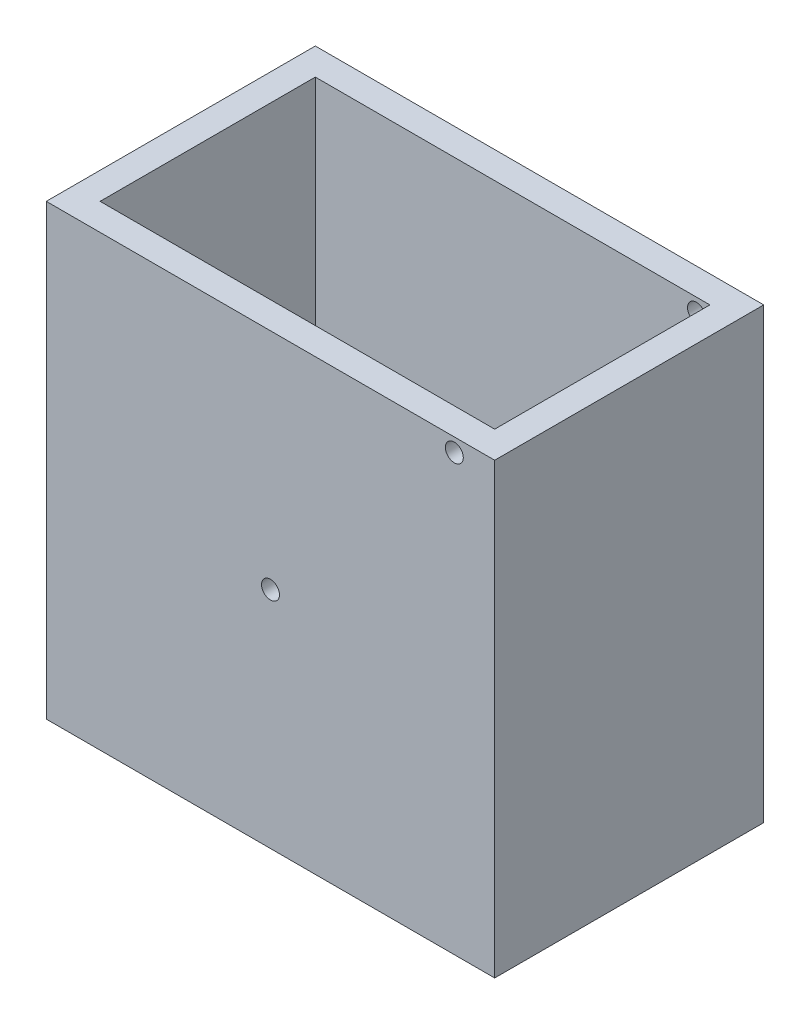
ISO-10303-21;
HEADER;
FILE_DESCRIPTION(('STEP AP214'),'2;1');
FILE_NAME('part.step','',(''),(''),'','','');
FILE_SCHEMA(('AUTOMOTIVE_DESIGN { 1 0 10303 214 1 1 1 1 }'));
ENDSEC;
DATA;
#1=APPLICATION_CONTEXT('core data for automotive mechanical design processes');
#2=APPLICATION_PROTOCOL_DEFINITION('international standard','automotive_design',2000,#1);
#3=PRODUCT_CONTEXT('',#1,'mechanical');
#4=PRODUCT('Part','Part','',(#3));
#5=PRODUCT_RELATED_PRODUCT_CATEGORY('part','',(#4));
#6=PRODUCT_DEFINITION_FORMATION('','',#4);
#7=PRODUCT_DEFINITION_CONTEXT('part definition',#1,'design');
#8=PRODUCT_DEFINITION('design','',#6,#7);
#9=PRODUCT_DEFINITION_SHAPE('','',#8);
#10=(LENGTH_UNIT() NAMED_UNIT(*) SI_UNIT(.MILLI.,.METRE.));
#11=(NAMED_UNIT(*) PLANE_ANGLE_UNIT() SI_UNIT($,.RADIAN.));
#12=(NAMED_UNIT(*) SI_UNIT($,.STERADIAN.) SOLID_ANGLE_UNIT());
#13=UNCERTAINTY_MEASURE_WITH_UNIT(LENGTH_MEASURE(1.E-05),#10,'distance_accuracy_value','');
#14=(GEOMETRIC_REPRESENTATION_CONTEXT(3) GLOBAL_UNCERTAINTY_ASSIGNED_CONTEXT((#13)) GLOBAL_UNIT_ASSIGNED_CONTEXT((#10,
#11,#12)) REPRESENTATION_CONTEXT('',''));
#15=CARTESIAN_POINT('',(0.,0.,0.));
#16=DIRECTION('',(0.,0.,1.));
#17=DIRECTION('',(1.,0.,0.));
#18=AXIS2_PLACEMENT_3D('',#15,#16,#17);
#19=CARTESIAN_POINT('',(0.,0.,150.));
#20=DIRECTION('',(1.,0.,0.));
#21=DIRECTION('',(0.,0.,-1.));
#22=AXIS2_PLACEMENT_3D('',#19,#20,#21);
#23=PLANE('',#22);
#24=DIRECTION('',(0.,-1.,0.));
#25=VECTOR('',#24,1.);
#26=CARTESIAN_POINT('',(0.,0.,0.));
#27=LINE('',#26,#25);
#28=CARTESIAN_POINT('',(0.,0.,0.));
#29=VERTEX_POINT('',#28);
#30=CARTESIAN_POINT('',(0.,-250.,0.));
#31=VERTEX_POINT('',#30);
#32=EDGE_CURVE('E148',#29,#31,#27,.T.);
#33=ORIENTED_EDGE('',*,*,#32,.T.);
#34=DIRECTION('',(0.,0.,-1.));
#35=VECTOR('',#34,1.);
#36=CARTESIAN_POINT('',(0.,-250.,150.));
#37=LINE('',#36,#35);
#38=CARTESIAN_POINT('',(0.,-250.,150.));
#39=VERTEX_POINT('',#38);
#40=EDGE_CURVE('E11',#39,#31,#37,.T.);
#41=ORIENTED_EDGE('',*,*,#40,.F.);
#42=DIRECTION('',(0.,-1.,0.));
#43=VECTOR('',#42,1.);
#44=CARTESIAN_POINT('',(0.,0.,150.));
#45=LINE('',#44,#43);
#46=CARTESIAN_POINT('',(0.,0.,150.));
#47=VERTEX_POINT('',#46);
#48=EDGE_CURVE('E152',#47,#39,#45,.T.);
#49=ORIENTED_EDGE('',*,*,#48,.F.);
#50=DIRECTION('',(0.,0.,-1.));
#51=VECTOR('',#50,1.);
#52=CARTESIAN_POINT('',(0.,0.,150.));
#53=LINE('',#52,#51);
#54=EDGE_CURVE('E158',#47,#29,#53,.T.);
#55=ORIENTED_EDGE('',*,*,#54,.T.);
#56=EDGE_LOOP('',(#33,#41,#49,#55));
#57=FACE_BOUND('',#56,.T.);
#58=ADVANCED_FACE('F35',(#57),#23,.F.);
#59=CARTESIAN_POINT('',(0.,-250.,150.));
#60=DIRECTION('',(0.,1.,0.));
#61=DIRECTION('',(0.,0.,1.));
#62=AXIS2_PLACEMENT_3D('',#59,#60,#61);
#63=PLANE('',#62);
#64=DIRECTION('',(1.,0.,0.));
#65=VECTOR('',#64,1.);
#66=CARTESIAN_POINT('',(0.,-250.,0.));
#67=LINE('',#66,#65);
#68=CARTESIAN_POINT('',(250.,-250.,0.));
#69=VERTEX_POINT('',#68);
#70=EDGE_CURVE('E161',#31,#69,#67,.T.);
#71=ORIENTED_EDGE('',*,*,#70,.T.);
#72=DIRECTION('',(0.,0.,-1.));
#73=VECTOR('',#72,1.);
#74=CARTESIAN_POINT('',(250.,-250.,150.));
#75=LINE('',#74,#73);
#76=CARTESIAN_POINT('',(250.,-250.,150.));
#77=VERTEX_POINT('',#76);
#78=EDGE_CURVE('E43',#77,#69,#75,.T.);
#79=ORIENTED_EDGE('',*,*,#78,.F.);
#80=DIRECTION('',(1.,0.,0.));
#81=VECTOR('',#80,1.);
#82=CARTESIAN_POINT('',(0.,-250.,150.));
#83=LINE('',#82,#81);
#84=EDGE_CURVE('E88',#39,#77,#83,.T.);
#85=ORIENTED_EDGE('',*,*,#84,.F.);
#86=ORIENTED_EDGE('',*,*,#40,.T.);
#87=EDGE_LOOP('',(#71,#79,#85,#86));
#88=FACE_BOUND('',#87,.T.);
#89=ADVANCED_FACE('F213',(#88),#63,.F.);
#90=CARTESIAN_POINT('',(250.,0.,150.));
#91=DIRECTION('',(-1.,0.,0.));
#92=DIRECTION('',(0.,-1.,0.));
#93=AXIS2_PLACEMENT_3D('',#90,#91,#92);
#94=PLANE('',#93);
#95=DIRECTION('',(0.,1.,0.));
#96=VECTOR('',#95,1.);
#97=CARTESIAN_POINT('',(250.,0.,0.));
#98=LINE('',#97,#96);
#99=CARTESIAN_POINT('',(250.,0.,0.));
#100=VERTEX_POINT('',#99);
#101=EDGE_CURVE('E163',#69,#100,#98,.T.);
#102=ORIENTED_EDGE('',*,*,#101,.T.);
#103=DIRECTION('',(0.,0.,-1.));
#104=VECTOR('',#103,1.);
#105=CARTESIAN_POINT('',(250.,0.,150.));
#106=LINE('',#105,#104);
#107=CARTESIAN_POINT('',(250.,0.,150.));
#108=VERTEX_POINT('',#107);
#109=EDGE_CURVE('E167',#108,#100,#106,.T.);
#110=ORIENTED_EDGE('',*,*,#109,.F.);
#111=DIRECTION('',(0.,1.,0.));
#112=VECTOR('',#111,1.);
#113=CARTESIAN_POINT('',(250.,0.,150.));
#114=LINE('',#113,#112);
#115=EDGE_CURVE('E155',#77,#108,#114,.T.);
#116=ORIENTED_EDGE('',*,*,#115,.F.);
#117=ORIENTED_EDGE('',*,*,#78,.T.);
#118=EDGE_LOOP('',(#102,#110,#116,#117));
#119=FACE_BOUND('',#118,.T.);
#120=ADVANCED_FACE('F218',(#119),#94,.F.);
#121=CARTESIAN_POINT('',(0.,0.,150.));
#122=DIRECTION('',(0.,-1.,0.));
#123=DIRECTION('',(0.,0.,-1.));
#124=AXIS2_PLACEMENT_3D('',#121,#122,#123);
#125=PLANE('',#124);
#126=DIRECTION('',(1.,0.,0.));
#127=VECTOR('',#126,1.);
#128=CARTESIAN_POINT('',(235.,0.,135.));
#129=LINE('',#128,#127);
#130=CARTESIAN_POINT('',(15.,0.,135.));
#131=VERTEX_POINT('',#130);
#132=CARTESIAN_POINT('',(235.,0.,135.));
#133=VERTEX_POINT('',#132);
#134=EDGE_CURVE('E142',#131,#133,#129,.T.);
#135=ORIENTED_EDGE('',*,*,#134,.F.);
#136=DIRECTION('',(0.,0.,1.));
#137=VECTOR('',#136,1.);
#138=CARTESIAN_POINT('',(15.,0.,135.));
#139=LINE('',#138,#137);
#140=CARTESIAN_POINT('',(15.,0.,15.));
#141=VERTEX_POINT('',#140);
#142=EDGE_CURVE('E51',#141,#131,#139,.T.);
#143=ORIENTED_EDGE('',*,*,#142,.F.);
#144=DIRECTION('',(-1.,0.,0.));
#145=VECTOR('',#144,1.);
#146=CARTESIAN_POINT('',(235.,0.,15.));
#147=LINE('',#146,#145);
#148=CARTESIAN_POINT('',(235.,0.,15.));
#149=VERTEX_POINT('',#148);
#150=EDGE_CURVE('E130',#149,#141,#147,.T.);
#151=ORIENTED_EDGE('',*,*,#150,.F.);
#152=DIRECTION('',(0.,0.,-1.));
#153=VECTOR('',#152,1.);
#154=CARTESIAN_POINT('',(235.,0.,135.));
#155=LINE('',#154,#153);
#156=EDGE_CURVE('E133',#133,#149,#155,.T.);
#157=ORIENTED_EDGE('',*,*,#156,.F.);
#158=EDGE_LOOP('',(#135,#143,#151,#157));
#159=FACE_BOUND('',#158,.T.);
#160=DIRECTION('',(-1.,0.,0.));
#161=VECTOR('',#160,1.);
#162=CARTESIAN_POINT('',(0.,0.,0.));
#163=LINE('',#162,#161);
#164=EDGE_CURVE('E81',#100,#29,#163,.T.);
#165=ORIENTED_EDGE('',*,*,#164,.T.);
#166=ORIENTED_EDGE('',*,*,#54,.F.);
#167=DIRECTION('',(-1.,0.,0.));
#168=VECTOR('',#167,1.);
#169=CARTESIAN_POINT('',(0.,0.,150.));
#170=LINE('',#169,#168);
#171=EDGE_CURVE('E60',#108,#47,#170,.T.);
#172=ORIENTED_EDGE('',*,*,#171,.F.);
#173=ORIENTED_EDGE('',*,*,#109,.T.);
#174=EDGE_LOOP('',(#165,#166,#172,#173));
#175=FACE_BOUND('',#174,.T.);
#176=ADVANCED_FACE('F230',(#159,#175),#125,.F.);
#177=CARTESIAN_POINT('',(0.,0.,150.));
#178=DIRECTION('',(0.,0.,1.));
#179=DIRECTION('',(1.,0.,0.));
#180=AXIS2_PLACEMENT_3D('',#177,#178,#179);
#181=PLANE('',#180);
#182=CARTESIAN_POINT('',(125.,-125.,150.));
#183=DIRECTION('',(0.,0.,1.));
#184=DIRECTION('',(1.,0.,0.));
#185=AXIS2_PLACEMENT_3D('',#182,#183,#184);
#186=CIRCLE('',#185,4.99999999999999);
#187=CARTESIAN_POINT('',(130.,-125.,150.));
#188=VERTEX_POINT('',#187);
#189=EDGE_CURVE('E173',#188,#188,#186,.T.);
#190=ORIENTED_EDGE('',*,*,#189,.F.);
#191=EDGE_LOOP('',(#190));
#192=FACE_BOUND('',#191,.T.);
#193=CARTESIAN_POINT('',(227.5,-7.5,150.));
#194=DIRECTION('',(0.,0.,1.));
#195=DIRECTION('',(-1.,0.,0.));
#196=AXIS2_PLACEMENT_3D('',#193,#194,#195);
#197=CIRCLE('',#196,4.99999999999999);
#198=CARTESIAN_POINT('',(232.5,-7.5,150.));
#199=VERTEX_POINT('',#198);
#200=EDGE_CURVE('E180',#199,#199,#197,.T.);
#201=ORIENTED_EDGE('',*,*,#200,.F.);
#202=EDGE_LOOP('',(#201));
#203=FACE_BOUND('',#202,.T.);
#204=ORIENTED_EDGE('',*,*,#48,.T.);
#205=ORIENTED_EDGE('',*,*,#84,.T.);
#206=ORIENTED_EDGE('',*,*,#115,.T.);
#207=ORIENTED_EDGE('',*,*,#171,.T.);
#208=EDGE_LOOP('',(#204,#205,#206,#207));
#209=FACE_BOUND('',#208,.T.);
#210=ADVANCED_FACE('F228',(#192,#203,#209),#181,.T.);
#211=CARTESIAN_POINT('',(0.,0.,0.));
#212=DIRECTION('',(0.,0.,1.));
#213=DIRECTION('',(1.,0.,0.));
#214=AXIS2_PLACEMENT_3D('',#211,#212,#213);
#215=PLANE('',#214);
#216=CARTESIAN_POINT('',(125.,-125.,0.));
#217=DIRECTION('',(0.,0.,1.));
#218=DIRECTION('',(1.,0.,0.));
#219=AXIS2_PLACEMENT_3D('',#216,#217,#218);
#220=CIRCLE('',#219,4.99999999999999);
#221=CARTESIAN_POINT('',(130.,-125.,0.));
#222=VERTEX_POINT('',#221);
#223=EDGE_CURVE('E136',#222,#222,#220,.T.);
#224=ORIENTED_EDGE('',*,*,#223,.T.);
#225=EDGE_LOOP('',(#224));
#226=FACE_BOUND('',#225,.T.);
#227=CARTESIAN_POINT('',(227.5,-7.5,0.));
#228=DIRECTION('',(0.,0.,1.));
#229=DIRECTION('',(1.,0.,0.));
#230=AXIS2_PLACEMENT_3D('',#227,#228,#229);
#231=CIRCLE('',#230,4.99999999999999);
#232=CARTESIAN_POINT('',(232.5,-7.5,0.));
#233=VERTEX_POINT('',#232);
#234=EDGE_CURVE('E177',#233,#233,#231,.T.);
#235=ORIENTED_EDGE('',*,*,#234,.T.);
#236=EDGE_LOOP('',(#235));
#237=FACE_BOUND('',#236,.T.);
#238=ORIENTED_EDGE('',*,*,#32,.F.);
#239=ORIENTED_EDGE('',*,*,#164,.F.);
#240=ORIENTED_EDGE('',*,*,#101,.F.);
#241=ORIENTED_EDGE('',*,*,#70,.F.);
#242=EDGE_LOOP('',(#238,#239,#240,#241));
#243=FACE_BOUND('',#242,.T.);
#244=ADVANCED_FACE('F223',(#226,#237,#243),#215,.F.);
#245=CARTESIAN_POINT('',(15.,-235.,135.));
#246=DIRECTION('',(-1.,0.,0.));
#247=DIRECTION('',(0.,0.,1.));
#248=AXIS2_PLACEMENT_3D('',#245,#246,#247);
#249=PLANE('',#248);
#250=ORIENTED_EDGE('',*,*,#142,.T.);
#251=DIRECTION('',(0.,1.,0.));
#252=VECTOR('',#251,1.);
#253=CARTESIAN_POINT('',(15.,-235.,135.));
#254=LINE('',#253,#252);
#255=CARTESIAN_POINT('',(15.,-235.,135.));
#256=VERTEX_POINT('',#255);
#257=EDGE_CURVE('E108',#256,#131,#254,.T.);
#258=ORIENTED_EDGE('',*,*,#257,.F.);
#259=DIRECTION('',(0.,0.,1.));
#260=VECTOR('',#259,1.);
#261=CARTESIAN_POINT('',(15.,-235.,135.));
#262=LINE('',#261,#260);
#263=CARTESIAN_POINT('',(15.,-235.,15.));
#264=VERTEX_POINT('',#263);
#265=EDGE_CURVE('E112',#264,#256,#262,.T.);
#266=ORIENTED_EDGE('',*,*,#265,.F.);
#267=DIRECTION('',(0.,1.,0.));
#268=VECTOR('',#267,1.);
#269=CARTESIAN_POINT('',(15.,-235.,15.));
#270=LINE('',#269,#268);
#271=EDGE_CURVE('E146',#264,#141,#270,.T.);
#272=ORIENTED_EDGE('',*,*,#271,.T.);
#273=EDGE_LOOP('',(#250,#258,#266,#272));
#274=FACE_BOUND('',#273,.T.);
#275=ADVANCED_FACE('F110',(#274),#249,.F.);
#276=CARTESIAN_POINT('',(235.,-235.,15.));
#277=DIRECTION('',(0.,0.,-1.));
#278=DIRECTION('',(-1.,0.,0.));
#279=AXIS2_PLACEMENT_3D('',#276,#277,#278);
#280=PLANE('',#279);
#281=CARTESIAN_POINT('',(125.,-125.,15.));
#282=DIRECTION('',(0.,0.,-1.));
#283=DIRECTION('',(-1.,0.,0.));
#284=AXIS2_PLACEMENT_3D('',#281,#282,#283);
#285=CIRCLE('',#284,4.99999999999999);
#286=CARTESIAN_POINT('',(130.,-125.,15.));
#287=VERTEX_POINT('',#286);
#288=EDGE_CURVE('E188',#287,#287,#285,.T.);
#289=ORIENTED_EDGE('',*,*,#288,.T.);
#290=EDGE_LOOP('',(#289));
#291=FACE_BOUND('',#290,.T.);
#292=CARTESIAN_POINT('',(227.5,-7.5,15.));
#293=DIRECTION('',(0.,0.,-1.));
#294=DIRECTION('',(-1.,0.,0.));
#295=AXIS2_PLACEMENT_3D('',#292,#293,#294);
#296=CIRCLE('',#295,4.99999999999999);
#297=CARTESIAN_POINT('',(232.5,-7.5,15.));
#298=VERTEX_POINT('',#297);
#299=EDGE_CURVE('E172',#298,#298,#296,.T.);
#300=ORIENTED_EDGE('',*,*,#299,.T.);
#301=EDGE_LOOP('',(#300));
#302=FACE_BOUND('',#301,.T.);
#303=ORIENTED_EDGE('',*,*,#150,.T.);
#304=ORIENTED_EDGE('',*,*,#271,.F.);
#305=DIRECTION('',(-1.,0.,0.));
#306=VECTOR('',#305,1.);
#307=CARTESIAN_POINT('',(235.,-235.,15.));
#308=LINE('',#307,#306);
#309=CARTESIAN_POINT('',(235.,-235.,15.));
#310=VERTEX_POINT('',#309);
#311=EDGE_CURVE('E118',#310,#264,#308,.T.);
#312=ORIENTED_EDGE('',*,*,#311,.F.);
#313=DIRECTION('',(0.,1.,0.));
#314=VECTOR('',#313,1.);
#315=CARTESIAN_POINT('',(235.,-235.,15.));
#316=LINE('',#315,#314);
#317=EDGE_CURVE('E149',#310,#149,#316,.T.);
#318=ORIENTED_EDGE('',*,*,#317,.T.);
#319=EDGE_LOOP('',(#303,#304,#312,#318));
#320=FACE_BOUND('',#319,.T.);
#321=ADVANCED_FACE('F264',(#291,#302,#320),#280,.F.);
#322=CARTESIAN_POINT('',(235.,-235.,135.));
#323=DIRECTION('',(1.,0.,0.));
#324=DIRECTION('',(0.,0.,-1.));
#325=AXIS2_PLACEMENT_3D('',#322,#323,#324);
#326=PLANE('',#325);
#327=ORIENTED_EDGE('',*,*,#156,.T.);
#328=ORIENTED_EDGE('',*,*,#317,.F.);
#329=DIRECTION('',(0.,0.,-1.));
#330=VECTOR('',#329,1.);
#331=CARTESIAN_POINT('',(235.,-235.,135.));
#332=LINE('',#331,#330);
#333=CARTESIAN_POINT('',(235.,-235.,135.));
#334=VERTEX_POINT('',#333);
#335=EDGE_CURVE('E126',#334,#310,#332,.T.);
#336=ORIENTED_EDGE('',*,*,#335,.F.);
#337=DIRECTION('',(0.,1.,0.));
#338=VECTOR('',#337,1.);
#339=CARTESIAN_POINT('',(235.,-235.,135.));
#340=LINE('',#339,#338);
#341=EDGE_CURVE('E117',#334,#133,#340,.T.);
#342=ORIENTED_EDGE('',*,*,#341,.T.);
#343=EDGE_LOOP('',(#327,#328,#336,#342));
#344=FACE_BOUND('',#343,.T.);
#345=ADVANCED_FACE('F271',(#344),#326,.F.);
#346=CARTESIAN_POINT('',(235.,-235.,135.));
#347=DIRECTION('',(0.,0.,1.));
#348=DIRECTION('',(1.,0.,0.));
#349=AXIS2_PLACEMENT_3D('',#346,#347,#348);
#350=PLANE('',#349);
#351=CARTESIAN_POINT('',(125.,-125.,135.));
#352=DIRECTION('',(0.,0.,1.));
#353=DIRECTION('',(1.,0.,0.));
#354=AXIS2_PLACEMENT_3D('',#351,#352,#353);
#355=CIRCLE('',#354,4.99999999999999);
#356=CARTESIAN_POINT('',(130.,-125.,135.));
#357=VERTEX_POINT('',#356);
#358=EDGE_CURVE('E38',#357,#357,#355,.T.);
#359=ORIENTED_EDGE('',*,*,#358,.T.);
#360=EDGE_LOOP('',(#359));
#361=FACE_BOUND('',#360,.T.);
#362=CARTESIAN_POINT('',(227.5,-7.5,135.));
#363=DIRECTION('',(0.,0.,1.));
#364=DIRECTION('',(1.,0.,0.));
#365=AXIS2_PLACEMENT_3D('',#362,#363,#364);
#366=CIRCLE('',#365,4.99999999999999);
#367=CARTESIAN_POINT('',(232.5,-7.5,135.));
#368=VERTEX_POINT('',#367);
#369=EDGE_CURVE('E170',#368,#368,#366,.T.);
#370=ORIENTED_EDGE('',*,*,#369,.T.);
#371=EDGE_LOOP('',(#370));
#372=FACE_BOUND('',#371,.T.);
#373=ORIENTED_EDGE('',*,*,#134,.T.);
#374=ORIENTED_EDGE('',*,*,#341,.F.);
#375=DIRECTION('',(1.,0.,0.));
#376=VECTOR('',#375,1.);
#377=CARTESIAN_POINT('',(235.,-235.,135.));
#378=LINE('',#377,#376);
#379=EDGE_CURVE('E121',#256,#334,#378,.T.);
#380=ORIENTED_EDGE('',*,*,#379,.F.);
#381=ORIENTED_EDGE('',*,*,#257,.T.);
#382=EDGE_LOOP('',(#373,#374,#380,#381));
#383=FACE_BOUND('',#382,.T.);
#384=ADVANCED_FACE('F122',(#361,#372,#383),#350,.F.);
#385=CARTESIAN_POINT('',(0.,-235.,0.));
#386=DIRECTION('',(0.,1.,0.));
#387=DIRECTION('',(0.,0.,1.));
#388=AXIS2_PLACEMENT_3D('',#385,#386,#387);
#389=PLANE('',#388);
#390=ORIENTED_EDGE('',*,*,#265,.T.);
#391=ORIENTED_EDGE('',*,*,#379,.T.);
#392=ORIENTED_EDGE('',*,*,#335,.T.);
#393=ORIENTED_EDGE('',*,*,#311,.T.);
#394=EDGE_LOOP('',(#390,#391,#392,#393));
#395=FACE_BOUND('',#394,.T.);
#396=ADVANCED_FACE('F128',(#395),#389,.T.);
#397=CARTESIAN_POINT('',(227.5,-7.5,-85.));
#398=DIRECTION('',(0.,0.,1.));
#399=DIRECTION('',(1.,0.,0.));
#400=AXIS2_PLACEMENT_3D('',#397,#398,#399);
#401=CYLINDRICAL_SURFACE('',#400,4.99999999999999);
#402=CARTESIAN_POINT('',(232.5,-7.5,150.));
#403=CARTESIAN_POINT('',(232.5,-7.5,149.84375));
#404=CARTESIAN_POINT('',(232.5,-7.5,149.6875));
#405=CARTESIAN_POINT('',(232.5,-7.5,149.375));
#406=CARTESIAN_POINT('',(232.5,-7.5,149.21875));
#407=CARTESIAN_POINT('',(232.5,-7.5,148.90625));
#408=CARTESIAN_POINT('',(232.5,-7.5,148.75));
#409=CARTESIAN_POINT('',(232.5,-7.5,148.4375));
#410=CARTESIAN_POINT('',(232.5,-7.5,148.28125));
#411=CARTESIAN_POINT('',(232.5,-7.5,147.96875));
#412=CARTESIAN_POINT('',(232.5,-7.5,147.8125));
#413=CARTESIAN_POINT('',(232.5,-7.5,147.5));
#414=CARTESIAN_POINT('',(232.5,-7.5,147.34375));
#415=CARTESIAN_POINT('',(232.5,-7.5,147.03125));
#416=CARTESIAN_POINT('',(232.5,-7.5,146.875));
#417=CARTESIAN_POINT('',(232.5,-7.5,146.5625));
#418=CARTESIAN_POINT('',(232.5,-7.5,146.40625));
#419=CARTESIAN_POINT('',(232.5,-7.5,146.09375));
#420=CARTESIAN_POINT('',(232.5,-7.5,145.9375));
#421=CARTESIAN_POINT('',(232.5,-7.5,145.625));
#422=CARTESIAN_POINT('',(232.5,-7.5,145.46875));
#423=CARTESIAN_POINT('',(232.5,-7.5,145.15625));
#424=CARTESIAN_POINT('',(232.5,-7.5,145.));
#425=CARTESIAN_POINT('',(232.5,-7.5,144.6875));
#426=CARTESIAN_POINT('',(232.5,-7.5,144.53125));
#427=CARTESIAN_POINT('',(232.5,-7.5,144.21875));
#428=CARTESIAN_POINT('',(232.5,-7.5,144.0625));
#429=CARTESIAN_POINT('',(232.5,-7.5,143.75));
#430=CARTESIAN_POINT('',(232.5,-7.5,143.59375));
#431=CARTESIAN_POINT('',(232.5,-7.5,143.28125));
#432=CARTESIAN_POINT('',(232.5,-7.5,143.125));
#433=CARTESIAN_POINT('',(232.5,-7.5,142.8125));
#434=CARTESIAN_POINT('',(232.5,-7.5,142.65625));
#435=CARTESIAN_POINT('',(232.5,-7.5,142.34375));
#436=CARTESIAN_POINT('',(232.5,-7.5,142.1875));
#437=CARTESIAN_POINT('',(232.5,-7.5,141.875));
#438=CARTESIAN_POINT('',(232.5,-7.5,141.71875));
#439=CARTESIAN_POINT('',(232.5,-7.5,141.40625));
#440=CARTESIAN_POINT('',(232.5,-7.5,141.25));
#441=CARTESIAN_POINT('',(232.5,-7.5,140.9375));
#442=CARTESIAN_POINT('',(232.5,-7.5,140.78125));
#443=CARTESIAN_POINT('',(232.5,-7.5,140.46875));
#444=CARTESIAN_POINT('',(232.5,-7.5,140.3125));
#445=CARTESIAN_POINT('',(232.5,-7.5,140.));
#446=CARTESIAN_POINT('',(232.5,-7.5,139.84375));
#447=CARTESIAN_POINT('',(232.5,-7.5,139.53125));
#448=CARTESIAN_POINT('',(232.5,-7.5,139.375));
#449=CARTESIAN_POINT('',(232.5,-7.5,139.0625));
#450=CARTESIAN_POINT('',(232.5,-7.5,138.90625));
#451=CARTESIAN_POINT('',(232.5,-7.5,138.59375));
#452=CARTESIAN_POINT('',(232.5,-7.5,138.4375));
#453=CARTESIAN_POINT('',(232.5,-7.5,138.125));
#454=CARTESIAN_POINT('',(232.5,-7.5,137.96875));
#455=CARTESIAN_POINT('',(232.5,-7.5,137.65625));
#456=CARTESIAN_POINT('',(232.5,-7.5,137.5));
#457=CARTESIAN_POINT('',(232.5,-7.5,137.1875));
#458=CARTESIAN_POINT('',(232.5,-7.5,137.03125));
#459=CARTESIAN_POINT('',(232.5,-7.5,136.71875));
#460=CARTESIAN_POINT('',(232.5,-7.5,136.5625));
#461=CARTESIAN_POINT('',(232.5,-7.5,136.25));
#462=CARTESIAN_POINT('',(232.5,-7.5,136.09375));
#463=CARTESIAN_POINT('',(232.5,-7.5,135.78125));
#464=CARTESIAN_POINT('',(232.5,-7.5,135.625));
#465=CARTESIAN_POINT('',(232.5,-7.5,135.3125));
#466=CARTESIAN_POINT('',(232.5,-7.5,135.15625));
#467=CARTESIAN_POINT('',(232.5,-7.5,135.));
#468=B_SPLINE_CURVE_WITH_KNOTS('',3,(#402,#403,#404,#405,#406,#407,#408,#409,#410,#411,#412,
#413,#414,#415,#416,#417,#418,#419,#420,#421,#422,#423,#424,#425,#426,#427,#428,#429,#430,#431,
#432,#433,#434,#435,#436,#437,#438,#439,#440,#441,#442,#443,#444,#445,#446,#447,#448,#449,#450,
#451,#452,#453,#454,#455,#456,#457,#458,#459,#460,#461,#462,#463,#464,#465,#466,#467),
.UNSPECIFIED.,.F.,.F.,(4,2,2,2,2,2,2,2,2,2,2,2,2,2,2,2,2,2,2,2,2,2,2,2,2,2,2,2,2,2,2,2,4),(0.,
0.46874999999999,0.937500000000008,1.40625,1.87499999999999,2.34375000000001,2.8125,
3.28124999999999,3.74999999999998,4.21874999999999,4.68749999999998,5.15624999999997,
5.62499999999999,6.09374999999998,6.56249999999997,7.03124999999999,7.49999999999998,
7.96874999999997,8.43749999999999,8.90624999999998,9.37499999999997,9.84374999999998,10.3125,
10.78125,11.25,11.71875,12.1875,12.65625,13.125,13.59375,14.0625,14.53125,15.),.UNSPECIFIED.);
#469=EDGE_CURVE('BSEAM200',#199,#368,#468,.T.);
#470=ORIENTED_EDGE('',*,*,#200,.T.);
#471=ORIENTED_EDGE('',*,*,#369,.F.);
#472=ORIENTED_EDGE('',*,*,#469,.T.);
#473=ORIENTED_EDGE('',*,*,#469,.F.);
#474=EDGE_LOOP('',(#470,#472,#471,#473));
#475=FACE_BOUND('',#474,.T.);
#476=ADVANCED_FACE('F200',(#475),#401,.F.);
#477=CARTESIAN_POINT('',(125.,-125.,-85.));
#478=DIRECTION('',(0.,0.,1.));
#479=DIRECTION('',(1.,0.,0.));
#480=AXIS2_PLACEMENT_3D('',#477,#478,#479);
#481=CYLINDRICAL_SURFACE('',#480,4.99999999999999);
#482=CARTESIAN_POINT('',(130.,-125.,150.));
#483=CARTESIAN_POINT('',(130.,-125.,149.84375));
#484=CARTESIAN_POINT('',(130.,-125.,149.6875));
#485=CARTESIAN_POINT('',(130.,-125.,149.375));
#486=CARTESIAN_POINT('',(130.,-125.,149.21875));
#487=CARTESIAN_POINT('',(130.,-125.,148.90625));
#488=CARTESIAN_POINT('',(130.,-125.,148.75));
#489=CARTESIAN_POINT('',(130.,-125.,148.4375));
#490=CARTESIAN_POINT('',(130.,-125.,148.28125));
#491=CARTESIAN_POINT('',(130.,-125.,147.96875));
#492=CARTESIAN_POINT('',(130.,-125.,147.8125));
#493=CARTESIAN_POINT('',(130.,-125.,147.5));
#494=CARTESIAN_POINT('',(130.,-125.,147.34375));
#495=CARTESIAN_POINT('',(130.,-125.,147.03125));
#496=CARTESIAN_POINT('',(130.,-125.,146.875));
#497=CARTESIAN_POINT('',(130.,-125.,146.5625));
#498=CARTESIAN_POINT('',(130.,-125.,146.40625));
#499=CARTESIAN_POINT('',(130.,-125.,146.09375));
#500=CARTESIAN_POINT('',(130.,-125.,145.9375));
#501=CARTESIAN_POINT('',(130.,-125.,145.625));
#502=CARTESIAN_POINT('',(130.,-125.,145.46875));
#503=CARTESIAN_POINT('',(130.,-125.,145.15625));
#504=CARTESIAN_POINT('',(130.,-125.,145.));
#505=CARTESIAN_POINT('',(130.,-125.,144.6875));
#506=CARTESIAN_POINT('',(130.,-125.,144.53125));
#507=CARTESIAN_POINT('',(130.,-125.,144.21875));
#508=CARTESIAN_POINT('',(130.,-125.,144.0625));
#509=CARTESIAN_POINT('',(130.,-125.,143.75));
#510=CARTESIAN_POINT('',(130.,-125.,143.59375));
#511=CARTESIAN_POINT('',(130.,-125.,143.28125));
#512=CARTESIAN_POINT('',(130.,-125.,143.125));
#513=CARTESIAN_POINT('',(130.,-125.,142.8125));
#514=CARTESIAN_POINT('',(130.,-125.,142.65625));
#515=CARTESIAN_POINT('',(130.,-125.,142.34375));
#516=CARTESIAN_POINT('',(130.,-125.,142.1875));
#517=CARTESIAN_POINT('',(130.,-125.,141.875));
#518=CARTESIAN_POINT('',(130.,-125.,141.71875));
#519=CARTESIAN_POINT('',(130.,-125.,141.40625));
#520=CARTESIAN_POINT('',(130.,-125.,141.25));
#521=CARTESIAN_POINT('',(130.,-125.,140.9375));
#522=CARTESIAN_POINT('',(130.,-125.,140.78125));
#523=CARTESIAN_POINT('',(130.,-125.,140.46875));
#524=CARTESIAN_POINT('',(130.,-125.,140.3125));
#525=CARTESIAN_POINT('',(130.,-125.,140.));
#526=CARTESIAN_POINT('',(130.,-125.,139.84375));
#527=CARTESIAN_POINT('',(130.,-125.,139.53125));
#528=CARTESIAN_POINT('',(130.,-125.,139.375));
#529=CARTESIAN_POINT('',(130.,-125.,139.0625));
#530=CARTESIAN_POINT('',(130.,-125.,138.90625));
#531=CARTESIAN_POINT('',(130.,-125.,138.59375));
#532=CARTESIAN_POINT('',(130.,-125.,138.4375));
#533=CARTESIAN_POINT('',(130.,-125.,138.125));
#534=CARTESIAN_POINT('',(130.,-125.,137.96875));
#535=CARTESIAN_POINT('',(130.,-125.,137.65625));
#536=CARTESIAN_POINT('',(130.,-125.,137.5));
#537=CARTESIAN_POINT('',(130.,-125.,137.1875));
#538=CARTESIAN_POINT('',(130.,-125.,137.03125));
#539=CARTESIAN_POINT('',(130.,-125.,136.71875));
#540=CARTESIAN_POINT('',(130.,-125.,136.5625));
#541=CARTESIAN_POINT('',(130.,-125.,136.25));
#542=CARTESIAN_POINT('',(130.,-125.,136.09375));
#543=CARTESIAN_POINT('',(130.,-125.,135.78125));
#544=CARTESIAN_POINT('',(130.,-125.,135.625));
#545=CARTESIAN_POINT('',(130.,-125.,135.3125));
#546=CARTESIAN_POINT('',(130.,-125.,135.15625));
#547=CARTESIAN_POINT('',(130.,-125.,135.));
#548=B_SPLINE_CURVE_WITH_KNOTS('',3,(#482,#483,#484,#485,#486,#487,#488,#489,#490,#491,#492,
#493,#494,#495,#496,#497,#498,#499,#500,#501,#502,#503,#504,#505,#506,#507,#508,#509,#510,#511,
#512,#513,#514,#515,#516,#517,#518,#519,#520,#521,#522,#523,#524,#525,#526,#527,#528,#529,#530,
#531,#532,#533,#534,#535,#536,#537,#538,#539,#540,#541,#542,#543,#544,#545,#546,#547),
.UNSPECIFIED.,.F.,.F.,(4,2,2,2,2,2,2,2,2,2,2,2,2,2,2,2,2,2,2,2,2,2,2,2,2,2,2,2,2,2,2,2,4),(0.,
0.46874999999999,0.937500000000008,1.40625,1.87499999999999,2.34375000000001,2.8125,
3.28124999999999,3.74999999999998,4.21874999999999,4.68749999999998,5.15624999999997,
5.62499999999999,6.09374999999998,6.56249999999997,7.03124999999999,7.49999999999998,
7.96874999999997,8.43749999999999,8.90624999999998,9.37499999999997,9.84374999999998,10.3125,
10.78125,11.25,11.71875,12.1875,12.65625,13.125,13.59375,14.0625,14.53125,15.),.UNSPECIFIED.);
#549=EDGE_CURVE('BSEAM197',#188,#357,#548,.T.);
#550=ORIENTED_EDGE('',*,*,#189,.T.);
#551=ORIENTED_EDGE('',*,*,#358,.F.);
#552=ORIENTED_EDGE('',*,*,#549,.T.);
#553=ORIENTED_EDGE('',*,*,#549,.F.);
#554=EDGE_LOOP('',(#550,#552,#551,#553));
#555=FACE_BOUND('',#554,.T.);
#556=ADVANCED_FACE('F197',(#555),#481,.F.);
#557=CARTESIAN_POINT('',(232.5,-7.5,15.));
#558=CARTESIAN_POINT('',(232.5,-7.5,14.84375));
#559=CARTESIAN_POINT('',(232.5,-7.5,14.6875));
#560=CARTESIAN_POINT('',(232.5,-7.5,14.375));
#561=CARTESIAN_POINT('',(232.5,-7.5,14.21875));
#562=CARTESIAN_POINT('',(232.5,-7.5,13.90625));
#563=CARTESIAN_POINT('',(232.5,-7.5,13.75));
#564=CARTESIAN_POINT('',(232.5,-7.5,13.4375));
#565=CARTESIAN_POINT('',(232.5,-7.5,13.28125));
#566=CARTESIAN_POINT('',(232.5,-7.5,12.96875));
#567=CARTESIAN_POINT('',(232.5,-7.5,12.8125));
#568=CARTESIAN_POINT('',(232.5,-7.5,12.5));
#569=CARTESIAN_POINT('',(232.5,-7.5,12.34375));
#570=CARTESIAN_POINT('',(232.5,-7.5,12.03125));
#571=CARTESIAN_POINT('',(232.5,-7.5,11.875));
#572=CARTESIAN_POINT('',(232.5,-7.5,11.5625));
#573=CARTESIAN_POINT('',(232.5,-7.5,11.40625));
#574=CARTESIAN_POINT('',(232.5,-7.5,11.09375));
#575=CARTESIAN_POINT('',(232.5,-7.5,10.9375));
#576=CARTESIAN_POINT('',(232.5,-7.5,10.625));
#577=CARTESIAN_POINT('',(232.5,-7.5,10.46875));
#578=CARTESIAN_POINT('',(232.5,-7.5,10.15625));
#579=CARTESIAN_POINT('',(232.5,-7.5,9.99999999999999));
#580=CARTESIAN_POINT('',(232.5,-7.5,9.6875));
#581=CARTESIAN_POINT('',(232.5,-7.5,9.53125));
#582=CARTESIAN_POINT('',(232.5,-7.5,9.21874999999999));
#583=CARTESIAN_POINT('',(232.5,-7.5,9.06249999999999));
#584=CARTESIAN_POINT('',(232.5,-7.5,8.74999999999999));
#585=CARTESIAN_POINT('',(232.5,-7.5,8.59375));
#586=CARTESIAN_POINT('',(232.5,-7.5,8.28125));
#587=CARTESIAN_POINT('',(232.5,-7.5,8.125));
#588=CARTESIAN_POINT('',(232.5,-7.5,7.8125));
#589=CARTESIAN_POINT('',(232.5,-7.5,7.65624999999999));
#590=CARTESIAN_POINT('',(232.5,-7.5,7.34374999999999));
#591=CARTESIAN_POINT('',(232.5,-7.5,7.18749999999999));
#592=CARTESIAN_POINT('',(232.5,-7.5,6.87499999999999));
#593=CARTESIAN_POINT('',(232.5,-7.5,6.71874999999999));
#594=CARTESIAN_POINT('',(232.5,-7.5,6.40624999999999));
#595=CARTESIAN_POINT('',(232.5,-7.5,6.24999999999999));
#596=CARTESIAN_POINT('',(232.5,-7.5,5.93749999999999));
#597=CARTESIAN_POINT('',(232.5,-7.5,5.78124999999999));
#598=CARTESIAN_POINT('',(232.5,-7.5,5.46874999999999));
#599=CARTESIAN_POINT('',(232.5,-7.5,5.31249999999999));
#600=CARTESIAN_POINT('',(232.5,-7.5,4.99999999999999));
#601=CARTESIAN_POINT('',(232.5,-7.5,4.84374999999999));
#602=CARTESIAN_POINT('',(232.5,-7.5,4.53125));
#603=CARTESIAN_POINT('',(232.5,-7.5,4.37499999999999));
#604=CARTESIAN_POINT('',(232.5,-7.5,4.06249999999999));
#605=CARTESIAN_POINT('',(232.5,-7.5,3.90624999999999));
#606=CARTESIAN_POINT('',(232.5,-7.5,3.59374999999999));
#607=CARTESIAN_POINT('',(232.5,-7.5,3.43749999999999));
#608=CARTESIAN_POINT('',(232.5,-7.5,3.12499999999998));
#609=CARTESIAN_POINT('',(232.5,-7.5,2.96874999999998));
#610=CARTESIAN_POINT('',(232.5,-7.5,2.65624999999998));
#611=CARTESIAN_POINT('',(232.5,-7.5,2.49999999999999));
#612=CARTESIAN_POINT('',(232.5,-7.5,2.18749999999999));
#613=CARTESIAN_POINT('',(232.5,-7.5,2.03124999999999));
#614=CARTESIAN_POINT('',(232.5,-7.5,1.71874999999999));
#615=CARTESIAN_POINT('',(232.5,-7.5,1.56249999999999));
#616=CARTESIAN_POINT('',(232.5,-7.5,1.24999999999999));
#617=CARTESIAN_POINT('',(232.5,-7.5,1.09374999999999));
#618=CARTESIAN_POINT('',(232.5,-7.5,0.781249999999993));
#619=CARTESIAN_POINT('',(232.5,-7.5,0.624999999999991));
#620=CARTESIAN_POINT('',(232.5,-7.5,0.312499999999989));
#621=CARTESIAN_POINT('',(232.5,-7.5,0.156249999999987));
#622=CARTESIAN_POINT('',(232.5,-7.5,0.));
#623=B_SPLINE_CURVE_WITH_KNOTS('',3,(#557,#558,#559,#560,#561,#562,#563,#564,#565,#566,#567,
#568,#569,#570,#571,#572,#573,#574,#575,#576,#577,#578,#579,#580,#581,#582,#583,#584,#585,#586,
#587,#588,#589,#590,#591,#592,#593,#594,#595,#596,#597,#598,#599,#600,#601,#602,#603,#604,#605,
#606,#607,#608,#609,#610,#611,#612,#613,#614,#615,#616,#617,#618,#619,#620,#621,#622),
.UNSPECIFIED.,.F.,.F.,(4,2,2,2,2,2,2,2,2,2,2,2,2,2,2,2,2,2,2,2,2,2,2,2,2,2,2,2,2,2,2,2,4),(0.,
0.468750000000004,0.937500000000008,1.40625,1.875,2.34375000000001,2.8125,3.28125,3.75,
4.21875000000001,4.68750000000001,5.15625,5.62500000000001,6.09375000000001,6.5625,7.03125,
7.50000000000001,7.96875000000001,8.43750000000001,8.90625,9.37500000000001,9.84375000000001,
10.3125,10.78125,11.25,11.71875,12.1875,12.65625,13.125,13.59375,14.0625,14.53125,15.),.UNSPECIFIED.);
#624=EDGE_CURVE('BSEAM199',#298,#233,#623,.T.);
#625=ORIENTED_EDGE('',*,*,#299,.F.);
#626=ORIENTED_EDGE('',*,*,#234,.F.);
#627=ORIENTED_EDGE('',*,*,#624,.T.);
#628=ORIENTED_EDGE('',*,*,#624,.F.);
#629=EDGE_LOOP('',(#625,#627,#626,#628));
#630=FACE_BOUND('',#629,.T.);
#631=ADVANCED_FACE('F199',(#630),#401,.F.);
#632=CARTESIAN_POINT('',(130.,-125.,15.));
#633=CARTESIAN_POINT('',(130.,-125.,14.84375));
#634=CARTESIAN_POINT('',(130.,-125.,14.6875));
#635=CARTESIAN_POINT('',(130.,-125.,14.375));
#636=CARTESIAN_POINT('',(130.,-125.,14.21875));
#637=CARTESIAN_POINT('',(130.,-125.,13.90625));
#638=CARTESIAN_POINT('',(130.,-125.,13.75));
#639=CARTESIAN_POINT('',(130.,-125.,13.4375));
#640=CARTESIAN_POINT('',(130.,-125.,13.28125));
#641=CARTESIAN_POINT('',(130.,-125.,12.96875));
#642=CARTESIAN_POINT('',(130.,-125.,12.8125));
#643=CARTESIAN_POINT('',(130.,-125.,12.5));
#644=CARTESIAN_POINT('',(130.,-125.,12.34375));
#645=CARTESIAN_POINT('',(130.,-125.,12.03125));
#646=CARTESIAN_POINT('',(130.,-125.,11.875));
#647=CARTESIAN_POINT('',(130.,-125.,11.5625));
#648=CARTESIAN_POINT('',(130.,-125.,11.40625));
#649=CARTESIAN_POINT('',(130.,-125.,11.09375));
#650=CARTESIAN_POINT('',(130.,-125.,10.9375));
#651=CARTESIAN_POINT('',(130.,-125.,10.625));
#652=CARTESIAN_POINT('',(130.,-125.,10.46875));
#653=CARTESIAN_POINT('',(130.,-125.,10.15625));
#654=CARTESIAN_POINT('',(130.,-125.,9.99999999999999));
#655=CARTESIAN_POINT('',(130.,-125.,9.6875));
#656=CARTESIAN_POINT('',(130.,-125.,9.53125));
#657=CARTESIAN_POINT('',(130.,-125.,9.21874999999999));
#658=CARTESIAN_POINT('',(130.,-125.,9.06249999999999));
#659=CARTESIAN_POINT('',(130.,-125.,8.74999999999999));
#660=CARTESIAN_POINT('',(130.,-125.,8.59375));
#661=CARTESIAN_POINT('',(130.,-125.,8.28125));
#662=CARTESIAN_POINT('',(130.,-125.,8.125));
#663=CARTESIAN_POINT('',(130.,-125.,7.8125));
#664=CARTESIAN_POINT('',(130.,-125.,7.65624999999999));
#665=CARTESIAN_POINT('',(130.,-125.,7.34374999999999));
#666=CARTESIAN_POINT('',(130.,-125.,7.18749999999999));
#667=CARTESIAN_POINT('',(130.,-125.,6.87499999999999));
#668=CARTESIAN_POINT('',(130.,-125.,6.71874999999999));
#669=CARTESIAN_POINT('',(130.,-125.,6.40624999999999));
#670=CARTESIAN_POINT('',(130.,-125.,6.24999999999999));
#671=CARTESIAN_POINT('',(130.,-125.,5.93749999999999));
#672=CARTESIAN_POINT('',(130.,-125.,5.78124999999999));
#673=CARTESIAN_POINT('',(130.,-125.,5.46874999999999));
#674=CARTESIAN_POINT('',(130.,-125.,5.31249999999999));
#675=CARTESIAN_POINT('',(130.,-125.,4.99999999999999));
#676=CARTESIAN_POINT('',(130.,-125.,4.84374999999999));
#677=CARTESIAN_POINT('',(130.,-125.,4.53125));
#678=CARTESIAN_POINT('',(130.,-125.,4.37499999999999));
#679=CARTESIAN_POINT('',(130.,-125.,4.06249999999999));
#680=CARTESIAN_POINT('',(130.,-125.,3.90624999999999));
#681=CARTESIAN_POINT('',(130.,-125.,3.59374999999999));
#682=CARTESIAN_POINT('',(130.,-125.,3.43749999999999));
#683=CARTESIAN_POINT('',(130.,-125.,3.12499999999998));
#684=CARTESIAN_POINT('',(130.,-125.,2.96874999999998));
#685=CARTESIAN_POINT('',(130.,-125.,2.65624999999998));
#686=CARTESIAN_POINT('',(130.,-125.,2.49999999999999));
#687=CARTESIAN_POINT('',(130.,-125.,2.18749999999999));
#688=CARTESIAN_POINT('',(130.,-125.,2.03124999999999));
#689=CARTESIAN_POINT('',(130.,-125.,1.71874999999999));
#690=CARTESIAN_POINT('',(130.,-125.,1.56249999999999));
#691=CARTESIAN_POINT('',(130.,-125.,1.24999999999999));
#692=CARTESIAN_POINT('',(130.,-125.,1.09374999999999));
#693=CARTESIAN_POINT('',(130.,-125.,0.781249999999993));
#694=CARTESIAN_POINT('',(130.,-125.,0.624999999999991));
#695=CARTESIAN_POINT('',(130.,-125.,0.312499999999989));
#696=CARTESIAN_POINT('',(130.,-125.,0.156249999999987));
#697=CARTESIAN_POINT('',(130.,-125.,0.));
#698=B_SPLINE_CURVE_WITH_KNOTS('',3,(#632,#633,#634,#635,#636,#637,#638,#639,#640,#641,#642,
#643,#644,#645,#646,#647,#648,#649,#650,#651,#652,#653,#654,#655,#656,#657,#658,#659,#660,#661,
#662,#663,#664,#665,#666,#667,#668,#669,#670,#671,#672,#673,#674,#675,#676,#677,#678,#679,#680,
#681,#682,#683,#684,#685,#686,#687,#688,#689,#690,#691,#692,#693,#694,#695,#696,#697),
.UNSPECIFIED.,.F.,.F.,(4,2,2,2,2,2,2,2,2,2,2,2,2,2,2,2,2,2,2,2,2,2,2,2,2,2,2,2,2,2,2,2,4),(0.,
0.468750000000004,0.937500000000008,1.40625,1.875,2.34375000000001,2.8125,3.28125,3.75,
4.21875000000001,4.68750000000001,5.15625,5.62500000000001,6.09375000000001,6.5625,7.03125,
7.50000000000001,7.96875000000001,8.43750000000001,8.90625,9.37500000000001,9.84375000000001,
10.3125,10.78125,11.25,11.71875,12.1875,12.65625,13.125,13.59375,14.0625,14.53125,15.),.UNSPECIFIED.);
#699=EDGE_CURVE('BSEAM202',#287,#222,#698,.T.);
#700=ORIENTED_EDGE('',*,*,#288,.F.);
#701=ORIENTED_EDGE('',*,*,#223,.F.);
#702=ORIENTED_EDGE('',*,*,#699,.T.);
#703=ORIENTED_EDGE('',*,*,#699,.F.);
#704=EDGE_LOOP('',(#700,#702,#701,#703));
#705=FACE_BOUND('',#704,.T.);
#706=ADVANCED_FACE('F202',(#705),#481,.F.);
#707=CLOSED_SHELL('',(#58,#89,#120,#176,#210,#244,#275,#321,#345,#384,#396,#476,#556,#631,#706));
#708=MANIFOLD_SOLID_BREP('B2',#707);
#709=ADVANCED_BREP_SHAPE_REPRESENTATION('',(#18,#708),#14);
#710=SHAPE_DEFINITION_REPRESENTATION(#9,#709);
ENDSEC;
END-ISO-10303-21;
